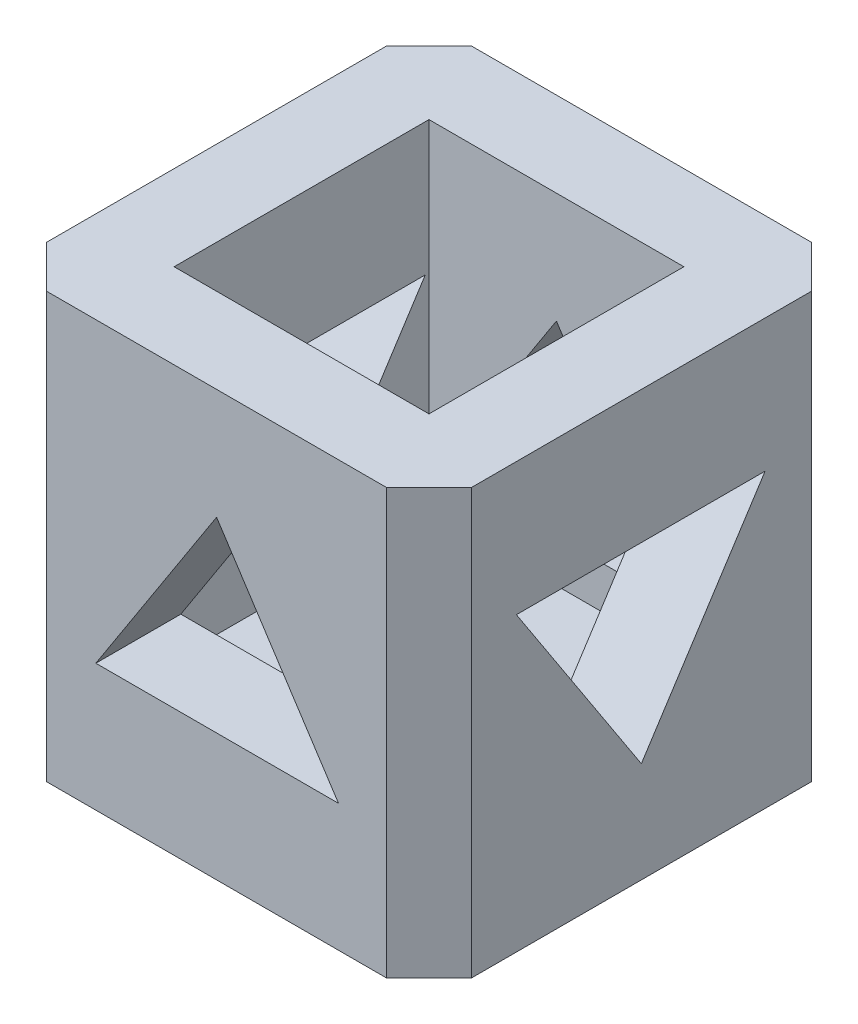
ISO-10303-21;
HEADER;
FILE_DESCRIPTION(('STEP AP214'),'2;1');
FILE_NAME('part.step','',(''),(''),'','','');
FILE_SCHEMA(('AUTOMOTIVE_DESIGN { 1 0 10303 214 1 1 1 1 }'));
ENDSEC;
DATA;
#1=APPLICATION_CONTEXT('core data for automotive mechanical design processes');
#2=APPLICATION_PROTOCOL_DEFINITION('international standard','automotive_design',2000,#1);
#3=PRODUCT_CONTEXT('',#1,'mechanical');
#4=PRODUCT('Part','Part','',(#3));
#5=PRODUCT_RELATED_PRODUCT_CATEGORY('part','',(#4));
#6=PRODUCT_DEFINITION_FORMATION('','',#4);
#7=PRODUCT_DEFINITION_CONTEXT('part definition',#1,'design');
#8=PRODUCT_DEFINITION('design','',#6,#7);
#9=PRODUCT_DEFINITION_SHAPE('','',#8);
#10=(LENGTH_UNIT() NAMED_UNIT(*) SI_UNIT(.MILLI.,.METRE.));
#11=(NAMED_UNIT(*) PLANE_ANGLE_UNIT() SI_UNIT($,.RADIAN.));
#12=(NAMED_UNIT(*) SI_UNIT($,.STERADIAN.) SOLID_ANGLE_UNIT());
#13=UNCERTAINTY_MEASURE_WITH_UNIT(LENGTH_MEASURE(1.E-05),#10,'distance_accuracy_value','');
#14=(GEOMETRIC_REPRESENTATION_CONTEXT(3) GLOBAL_UNCERTAINTY_ASSIGNED_CONTEXT((#13)) GLOBAL_UNIT_ASSIGNED_CONTEXT((#10,
#11,#12)) REPRESENTATION_CONTEXT('',''));
#15=CARTESIAN_POINT('',(0.,0.,0.));
#16=DIRECTION('',(0.,0.,1.));
#17=DIRECTION('',(1.,0.,0.));
#18=AXIS2_PLACEMENT_3D('',#15,#16,#17);
#19=CARTESIAN_POINT('',(-10.,4.,-10.));
#20=DIRECTION('',(0.,0.,1.));
#21=DIRECTION('',(1.,0.,0.));
#22=AXIS2_PLACEMENT_3D('',#19,#20,#21);
#23=PLANE('',#22);
#24=DIRECTION('',(1.,0.,0.));
#25=VECTOR('',#24,1.);
#26=CARTESIAN_POINT('',(-10.,5.99136703861879,-10.));
#27=LINE('',#26,#25);
#28=CARTESIAN_POINT('',(-5.68500652357617,5.99136703861879,-10.));
#29=VERTEX_POINT('',#28);
#30=CARTESIAN_POINT('',(5.73967274341431,5.99136703861879,-10.));
#31=VERTEX_POINT('',#30);
#32=EDGE_CURVE('E272',#29,#31,#27,.T.);
#33=ORIENTED_EDGE('',*,*,#32,.T.);
#34=DIRECTION('',(-0.546505514379067,0.83745550493938,0.));
#35=VECTOR('',#34,1.);
#36=CARTESIAN_POINT('',(1.95012882129267,11.7983979564973,-10.));
#37=LINE('',#36,#35);
#38=CARTESIAN_POINT('',(0.,14.7867413011899,-10.));
#39=VERTEX_POINT('',#38);
#40=EDGE_CURVE('E277',#31,#39,#37,.T.);
#41=ORIENTED_EDGE('',*,*,#40,.T.);
#42=DIRECTION('',(-0.542839434163887,-0.839836501181409,0.));
#43=VECTOR('',#42,1.);
#44=CARTESIAN_POINT('',(-7.8643827279489,2.61961552049709,-10.));
#45=LINE('',#44,#43);
#46=EDGE_CURVE('E266',#39,#29,#45,.T.);
#47=ORIENTED_EDGE('',*,*,#46,.T.);
#48=EDGE_LOOP('',(#33,#41,#47));
#49=FACE_BOUND('',#48,.T.);
#50=DIRECTION('',(-1.,0.,0.));
#51=VECTOR('',#50,1.);
#52=CARTESIAN_POINT('',(-10.,20.,-10.));
#53=LINE('',#52,#51);
#54=CARTESIAN_POINT('',(8.,20.,-10.));
#55=VERTEX_POINT('',#54);
#56=CARTESIAN_POINT('',(-7.99999999999999,20.,-10.));
#57=VERTEX_POINT('',#56);
#58=EDGE_CURVE('E316',#55,#57,#53,.T.);
#59=ORIENTED_EDGE('',*,*,#58,.F.);
#60=DIRECTION('',(0.,-1.,0.));
#61=VECTOR('',#60,1.);
#62=CARTESIAN_POINT('',(8.,4.,-10.));
#63=LINE('',#62,#61);
#64=CARTESIAN_POINT('',(8.,0.,-10.));
#65=VERTEX_POINT('',#64);
#66=EDGE_CURVE('E344',#55,#65,#63,.T.);
#67=ORIENTED_EDGE('',*,*,#66,.T.);
#68=DIRECTION('',(-1.,0.,0.));
#69=VECTOR('',#68,1.);
#70=CARTESIAN_POINT('',(-10.,0.,-10.));
#71=LINE('',#70,#69);
#72=CARTESIAN_POINT('',(-7.99999999999999,0.,-10.));
#73=VERTEX_POINT('',#72);
#74=EDGE_CURVE('E319',#65,#73,#71,.T.);
#75=ORIENTED_EDGE('',*,*,#74,.T.);
#76=DIRECTION('',(0.,1.,0.));
#77=VECTOR('',#76,1.);
#78=CARTESIAN_POINT('',(-7.99999999999999,4.,-10.));
#79=LINE('',#78,#77);
#80=EDGE_CURVE('E342',#73,#57,#79,.T.);
#81=ORIENTED_EDGE('',*,*,#80,.T.);
#82=EDGE_LOOP('',(#59,#67,#75,#81));
#83=FACE_BOUND('',#82,.T.);
#84=ADVANCED_FACE('F35',(#49,#83),#23,.F.);
#85=CARTESIAN_POINT('',(-10.,4.,10.));
#86=DIRECTION('',(1.,0.,0.));
#87=DIRECTION('',(0.,0.,-1.));
#88=AXIS2_PLACEMENT_3D('',#85,#86,#87);
#89=PLANE('',#88);
#90=DIRECTION('',(0.,0.,1.));
#91=VECTOR('',#90,1.);
#92=CARTESIAN_POINT('',(-10.,13.7547902893006,10.));
#93=LINE('',#92,#91);
#94=CARTESIAN_POINT('',(-10.,13.7547902893006,-5.82500419723984));
#95=VERTEX_POINT('',#94);
#96=CARTESIAN_POINT('',(-10.,13.7547902893006,5.88566383682266));
#97=VERTEX_POINT('',#96);
#98=EDGE_CURVE('E237',#95,#97,#93,.T.);
#99=ORIENTED_EDGE('',*,*,#98,.T.);
#100=DIRECTION('',(0.,-0.837455504939375,-0.546505514379073));
#101=VECTOR('',#100,1.);
#102=CARTESIAN_POINT('',(-10.,8.79647131162845,2.64997113749006));
#103=LINE('',#102,#101);
#104=CARTESIAN_POINT('',(-10.,4.73924544841337,0.00231249264187865));
#105=VERTEX_POINT('',#104);
#106=EDGE_CURVE('E243',#97,#105,#103,.T.);
#107=ORIENTED_EDGE('',*,*,#106,.T.);
#108=DIRECTION('',(0.,0.839836501181413,-0.542839434163881));
#109=VECTOR('',#108,1.);
#110=CARTESIAN_POINT('',(-10.,-0.340072559187292,3.28539688979022));
#111=LINE('',#110,#109);
#112=EDGE_CURVE('E232',#105,#95,#111,.T.);
#113=ORIENTED_EDGE('',*,*,#112,.T.);
#114=EDGE_LOOP('',(#99,#107,#113));
#115=FACE_BOUND('',#114,.T.);
#116=DIRECTION('',(0.,0.,1.));
#117=VECTOR('',#116,1.);
#118=CARTESIAN_POINT('',(-10.,0.,10.));
#119=LINE('',#118,#117);
#120=CARTESIAN_POINT('',(-10.,0.,-8.));
#121=VERTEX_POINT('',#120);
#122=CARTESIAN_POINT('',(-10.,0.,7.99999999999999));
#123=VERTEX_POINT('',#122);
#124=EDGE_CURVE('E322',#121,#123,#119,.T.);
#125=ORIENTED_EDGE('',*,*,#124,.T.);
#126=DIRECTION('',(0.,1.,0.));
#127=VECTOR('',#126,1.);
#128=CARTESIAN_POINT('',(-10.,4.,7.99999999999999));
#129=LINE('',#128,#127);
#130=CARTESIAN_POINT('',(-10.,20.,7.99999999999999));
#131=VERTEX_POINT('',#130);
#132=EDGE_CURVE('E11',#123,#131,#129,.T.);
#133=ORIENTED_EDGE('',*,*,#132,.T.);
#134=DIRECTION('',(0.,0.,1.));
#135=VECTOR('',#134,1.);
#136=CARTESIAN_POINT('',(-10.,20.,-10.));
#137=LINE('',#136,#135);
#138=CARTESIAN_POINT('',(-10.,20.,-8.));
#139=VERTEX_POINT('',#138);
#140=EDGE_CURVE('E309',#139,#131,#137,.T.);
#141=ORIENTED_EDGE('',*,*,#140,.F.);
#142=DIRECTION('',(0.,-1.,0.));
#143=VECTOR('',#142,1.);
#144=CARTESIAN_POINT('',(-10.,4.,-8.));
#145=LINE('',#144,#143);
#146=EDGE_CURVE('E44',#139,#121,#145,.T.);
#147=ORIENTED_EDGE('',*,*,#146,.T.);
#148=EDGE_LOOP('',(#125,#133,#141,#147));
#149=FACE_BOUND('',#148,.T.);
#150=ADVANCED_FACE('F375',(#115,#149),#89,.F.);
#151=CARTESIAN_POINT('',(-10.,4.,10.));
#152=DIRECTION('',(0.,0.,-1.));
#153=DIRECTION('',(-1.,0.,0.));
#154=AXIS2_PLACEMENT_3D('',#151,#152,#153);
#155=PLANE('',#154);
#156=DIRECTION('',(-0.542839434163887,-0.839836501181409,0.));
#157=VECTOR('',#156,1.);
#158=CARTESIAN_POINT('',(0.,14.7867413011899,10.));
#159=LINE('',#158,#157);
#160=CARTESIAN_POINT('',(0.,14.7867413011899,10.));
#161=VERTEX_POINT('',#160);
#162=CARTESIAN_POINT('',(-5.68500652357618,5.99136703861879,10.));
#163=VERTEX_POINT('',#162);
#164=EDGE_CURVE('E248',#161,#163,#159,.T.);
#165=ORIENTED_EDGE('',*,*,#164,.F.);
#166=DIRECTION('',(-0.546505514379067,0.837455504939379,0.));
#167=VECTOR('',#166,1.);
#168=CARTESIAN_POINT('',(5.73967274341431,5.99136703861879,10.));
#169=LINE('',#168,#167);
#170=CARTESIAN_POINT('',(5.73967274341431,5.99136703861879,10.));
#171=VERTEX_POINT('',#170);
#172=EDGE_CURVE('E246',#171,#161,#169,.T.);
#173=ORIENTED_EDGE('',*,*,#172,.F.);
#174=DIRECTION('',(1.,0.,0.));
#175=VECTOR('',#174,1.);
#176=CARTESIAN_POINT('',(-5.68500652357618,5.99136703861879,10.));
#177=LINE('',#176,#175);
#178=EDGE_CURVE('E251',#163,#171,#177,.T.);
#179=ORIENTED_EDGE('',*,*,#178,.F.);
#180=EDGE_LOOP('',(#165,#173,#179));
#181=FACE_BOUND('',#180,.T.);
#182=DIRECTION('',(1.,0.,0.));
#183=VECTOR('',#182,1.);
#184=CARTESIAN_POINT('',(-10.,0.,10.));
#185=LINE('',#184,#183);
#186=CARTESIAN_POINT('',(-8.,0.,10.));
#187=VERTEX_POINT('',#186);
#188=CARTESIAN_POINT('',(7.99999999999999,0.,10.));
#189=VERTEX_POINT('',#188);
#190=EDGE_CURVE('E325',#187,#189,#185,.T.);
#191=ORIENTED_EDGE('',*,*,#190,.T.);
#192=DIRECTION('',(0.,1.,0.));
#193=VECTOR('',#192,1.);
#194=CARTESIAN_POINT('',(7.99999999999999,4.,10.));
#195=LINE('',#194,#193);
#196=CARTESIAN_POINT('',(7.99999999999999,20.,10.));
#197=VERTEX_POINT('',#196);
#198=EDGE_CURVE('E51',#189,#197,#195,.T.);
#199=ORIENTED_EDGE('',*,*,#198,.T.);
#200=DIRECTION('',(1.,0.,0.));
#201=VECTOR('',#200,1.);
#202=CARTESIAN_POINT('',(-10.,20.,10.));
#203=LINE('',#202,#201);
#204=CARTESIAN_POINT('',(-8.,20.,10.));
#205=VERTEX_POINT('',#204);
#206=EDGE_CURVE('E311',#205,#197,#203,.T.);
#207=ORIENTED_EDGE('',*,*,#206,.F.);
#208=DIRECTION('',(0.,-1.,0.));
#209=VECTOR('',#208,1.);
#210=CARTESIAN_POINT('',(-8.,4.,10.));
#211=LINE('',#210,#209);
#212=EDGE_CURVE('E367',#205,#187,#211,.T.);
#213=ORIENTED_EDGE('',*,*,#212,.T.);
#214=EDGE_LOOP('',(#191,#199,#207,#213));
#215=FACE_BOUND('',#214,.T.);
#216=ADVANCED_FACE('F386',(#181,#215),#155,.F.);
#217=CARTESIAN_POINT('',(10.,4.,10.));
#218=DIRECTION('',(-1.,0.,0.));
#219=DIRECTION('',(0.,0.,1.));
#220=AXIS2_PLACEMENT_3D('',#217,#218,#219);
#221=PLANE('',#220);
#222=DIRECTION('',(0.,0.839836501181413,-0.542839434163881));
#223=VECTOR('',#222,1.);
#224=CARTESIAN_POINT('',(10.,4.73924544841337,0.00231249264187865));
#225=LINE('',#224,#223);
#226=CARTESIAN_POINT('',(10.,4.73924544841337,0.00231249264187735));
#227=VERTEX_POINT('',#226);
#228=CARTESIAN_POINT('',(10.,13.7547902893006,-5.82500419723984));
#229=VERTEX_POINT('',#228);
#230=EDGE_CURVE('E214',#227,#229,#225,.T.);
#231=ORIENTED_EDGE('',*,*,#230,.F.);
#232=DIRECTION('',(0.,-0.837455504939375,-0.546505514379073));
#233=VECTOR('',#232,1.);
#234=CARTESIAN_POINT('',(10.,13.7547902893006,5.88566383682266));
#235=LINE('',#234,#233);
#236=CARTESIAN_POINT('',(10.,13.7547902893006,5.88566383682266));
#237=VERTEX_POINT('',#236);
#238=EDGE_CURVE('E219',#237,#227,#235,.T.);
#239=ORIENTED_EDGE('',*,*,#238,.F.);
#240=DIRECTION('',(0.,0.,1.));
#241=VECTOR('',#240,1.);
#242=CARTESIAN_POINT('',(10.,13.7547902893006,-5.82500419723984));
#243=LINE('',#242,#241);
#244=EDGE_CURVE('E203',#229,#237,#243,.T.);
#245=ORIENTED_EDGE('',*,*,#244,.F.);
#246=EDGE_LOOP('',(#231,#239,#245));
#247=FACE_BOUND('',#246,.T.);
#248=DIRECTION('',(0.,0.,-1.));
#249=VECTOR('',#248,1.);
#250=CARTESIAN_POINT('',(10.,0.,10.));
#251=LINE('',#250,#249);
#252=CARTESIAN_POINT('',(10.,0.,8.));
#253=VERTEX_POINT('',#252);
#254=CARTESIAN_POINT('',(10.,0.,-7.99999999999999));
#255=VERTEX_POINT('',#254);
#256=EDGE_CURVE('E327',#253,#255,#251,.T.);
#257=ORIENTED_EDGE('',*,*,#256,.T.);
#258=DIRECTION('',(0.,1.,0.));
#259=VECTOR('',#258,1.);
#260=CARTESIAN_POINT('',(10.,4.,-7.99999999999999));
#261=LINE('',#260,#259);
#262=CARTESIAN_POINT('',(10.,20.,-7.99999999999999));
#263=VERTEX_POINT('',#262);
#264=EDGE_CURVE('E358',#255,#263,#261,.T.);
#265=ORIENTED_EDGE('',*,*,#264,.T.);
#266=DIRECTION('',(0.,0.,-1.));
#267=VECTOR('',#266,1.);
#268=CARTESIAN_POINT('',(10.,20.,-10.));
#269=LINE('',#268,#267);
#270=CARTESIAN_POINT('',(10.,20.,8.));
#271=VERTEX_POINT('',#270);
#272=EDGE_CURVE('E313',#271,#263,#269,.T.);
#273=ORIENTED_EDGE('',*,*,#272,.F.);
#274=DIRECTION('',(0.,-1.,0.));
#275=VECTOR('',#274,1.);
#276=CARTESIAN_POINT('',(10.,4.,8.));
#277=LINE('',#276,#275);
#278=EDGE_CURVE('E355',#271,#253,#277,.T.);
#279=ORIENTED_EDGE('',*,*,#278,.T.);
#280=EDGE_LOOP('',(#257,#265,#273,#279));
#281=FACE_BOUND('',#280,.T.);
#282=ADVANCED_FACE('F221',(#247,#281),#221,.F.);
#283=CARTESIAN_POINT('',(0.,0.,0.));
#284=DIRECTION('',(0.,1.,0.));
#285=DIRECTION('',(0.,0.,1.));
#286=AXIS2_PLACEMENT_3D('',#283,#284,#285);
#287=PLANE('',#286);
#288=ORIENTED_EDGE('',*,*,#74,.F.);
#289=DIRECTION('',(-0.707106781186547,0.,-0.707106781186548));
#290=VECTOR('',#289,1.);
#291=CARTESIAN_POINT('',(8.,0.,-10.));
#292=LINE('',#291,#290);
#293=EDGE_CURVE('E353',#65,#255,#292,.F.);
#294=ORIENTED_EDGE('',*,*,#293,.T.);
#295=ORIENTED_EDGE('',*,*,#256,.F.);
#296=DIRECTION('',(0.707106781186548,0.,-0.707106781186547));
#297=VECTOR('',#296,1.);
#298=CARTESIAN_POINT('',(10.,0.,8.));
#299=LINE('',#298,#297);
#300=EDGE_CURVE('E351',#253,#189,#299,.F.);
#301=ORIENTED_EDGE('',*,*,#300,.T.);
#302=ORIENTED_EDGE('',*,*,#190,.F.);
#303=DIRECTION('',(0.707106781186547,0.,0.707106781186548));
#304=VECTOR('',#303,1.);
#305=CARTESIAN_POINT('',(-8.,0.,10.));
#306=LINE('',#305,#304);
#307=EDGE_CURVE('E349',#187,#123,#306,.F.);
#308=ORIENTED_EDGE('',*,*,#307,.T.);
#309=ORIENTED_EDGE('',*,*,#124,.F.);
#310=DIRECTION('',(-0.707106781186548,0.,0.707106781186547));
#311=VECTOR('',#310,1.);
#312=CARTESIAN_POINT('',(-10.,0.,-8.));
#313=LINE('',#312,#311);
#314=EDGE_CURVE('E347',#121,#73,#313,.F.);
#315=ORIENTED_EDGE('',*,*,#314,.T.);
#316=EDGE_LOOP('',(#288,#294,#295,#301,#302,#308,#309,#315));
#317=FACE_BOUND('',#316,.T.);
#318=ADVANCED_FACE('F381',(#317),#287,.F.);
#319=CARTESIAN_POINT('',(0.,20.,0.));
#320=DIRECTION('',(0.,1.,0.));
#321=DIRECTION('',(0.,0.,1.));
#322=AXIS2_PLACEMENT_3D('',#319,#320,#321);
#323=PLANE('',#322);
#324=ORIENTED_EDGE('',*,*,#272,.T.);
#325=DIRECTION('',(0.707106781186547,0.,0.707106781186548));
#326=VECTOR('',#325,1.);
#327=CARTESIAN_POINT('',(9.00000000000001,20.,-8.99999999999999));
#328=LINE('',#327,#326);
#329=EDGE_CURVE('E365',#263,#55,#328,.F.);
#330=ORIENTED_EDGE('',*,*,#329,.T.);
#331=ORIENTED_EDGE('',*,*,#58,.T.);
#332=DIRECTION('',(0.707106781186548,0.,-0.707106781186547));
#333=VECTOR('',#332,1.);
#334=CARTESIAN_POINT('',(-8.99999999999999,20.,-9.00000000000001));
#335=LINE('',#334,#333);
#336=EDGE_CURVE('E360',#57,#139,#335,.F.);
#337=ORIENTED_EDGE('',*,*,#336,.T.);
#338=ORIENTED_EDGE('',*,*,#140,.T.);
#339=DIRECTION('',(-0.707106781186547,0.,-0.707106781186548));
#340=VECTOR('',#339,1.);
#341=CARTESIAN_POINT('',(-9.00000000000001,20.,8.99999999999999));
#342=LINE('',#341,#340);
#343=EDGE_CURVE('E58',#131,#205,#342,.F.);
#344=ORIENTED_EDGE('',*,*,#343,.T.);
#345=ORIENTED_EDGE('',*,*,#206,.T.);
#346=DIRECTION('',(-0.707106781186548,0.,0.707106781186547));
#347=VECTOR('',#346,1.);
#348=CARTESIAN_POINT('',(8.99999999999999,20.,9.00000000000001));
#349=LINE('',#348,#347);
#350=EDGE_CURVE('E363',#197,#271,#349,.F.);
#351=ORIENTED_EDGE('',*,*,#350,.T.);
#352=EDGE_LOOP('',(#324,#330,#331,#337,#338,#344,#345,#351));
#353=FACE_BOUND('',#352,.T.);
#354=DIRECTION('',(1.,0.,0.));
#355=VECTOR('',#354,1.);
#356=CARTESIAN_POINT('',(-6.,20.,6.));
#357=LINE('',#356,#355);
#358=CARTESIAN_POINT('',(-6.,20.,6.));
#359=VERTEX_POINT('',#358);
#360=CARTESIAN_POINT('',(6.,20.,6.));
#361=VERTEX_POINT('',#360);
#362=EDGE_CURVE('E283',#359,#361,#357,.T.);
#363=ORIENTED_EDGE('',*,*,#362,.F.);
#364=DIRECTION('',(0.,0.,1.));
#365=VECTOR('',#364,1.);
#366=CARTESIAN_POINT('',(-6.,20.,-6.));
#367=LINE('',#366,#365);
#368=CARTESIAN_POINT('',(-6.,20.,-6.));
#369=VERTEX_POINT('',#368);
#370=EDGE_CURVE('E281',#369,#359,#367,.T.);
#371=ORIENTED_EDGE('',*,*,#370,.F.);
#372=DIRECTION('',(-1.,0.,0.));
#373=VECTOR('',#372,1.);
#374=CARTESIAN_POINT('',(-6.,20.,-6.));
#375=LINE('',#374,#373);
#376=CARTESIAN_POINT('',(6.,20.,-6.));
#377=VERTEX_POINT('',#376);
#378=EDGE_CURVE('E289',#377,#369,#375,.T.);
#379=ORIENTED_EDGE('',*,*,#378,.F.);
#380=DIRECTION('',(0.,0.,-1.));
#381=VECTOR('',#380,1.);
#382=CARTESIAN_POINT('',(6.,20.,-6.));
#383=LINE('',#382,#381);
#384=EDGE_CURVE('E286',#361,#377,#383,.T.);
#385=ORIENTED_EDGE('',*,*,#384,.F.);
#386=EDGE_LOOP('',(#363,#371,#379,#385));
#387=FACE_BOUND('',#386,.T.);
#388=ADVANCED_FACE('F388',(#353,#387),#323,.T.);
#389=CARTESIAN_POINT('',(-6.,20.,-6.));
#390=DIRECTION('',(1.,0.,0.));
#391=DIRECTION('',(0.,0.,-1.));
#392=AXIS2_PLACEMENT_3D('',#389,#390,#391);
#393=PLANE('',#392);
#394=DIRECTION('',(0.,-0.837455504939375,-0.546505514379073));
#395=VECTOR('',#394,1.);
#396=CARTESIAN_POINT('',(-6.,12.694994051737,5.19406352548597));
#397=LINE('',#396,#395);
#398=CARTESIAN_POINT('',(-6.,13.7547902893006,5.88566383682266));
#399=VERTEX_POINT('',#398);
#400=CARTESIAN_POINT('',(-6.,4.73924544841337,0.00231249264187605));
#401=VERTEX_POINT('',#400);
#402=EDGE_CURVE('E240',#399,#401,#397,.T.);
#403=ORIENTED_EDGE('',*,*,#402,.F.);
#404=DIRECTION('',(0.,0.,1.));
#405=VECTOR('',#404,1.);
#406=CARTESIAN_POINT('',(-6.,13.7547902893006,-6.));
#407=LINE('',#406,#405);
#408=CARTESIAN_POINT('',(-6.,13.7547902893006,-5.82500419723984));
#409=VERTEX_POINT('',#408);
#410=EDGE_CURVE('E235',#409,#399,#407,.T.);
#411=ORIENTED_EDGE('',*,*,#410,.F.);
#412=DIRECTION('',(0.,0.839836501181413,-0.542839434163881));
#413=VECTOR('',#412,1.);
#414=CARTESIAN_POINT('',(-6.,18.2394749577428,-8.72373946820746));
#415=LINE('',#414,#413);
#416=EDGE_CURVE('E230',#401,#409,#415,.T.);
#417=ORIENTED_EDGE('',*,*,#416,.F.);
#418=EDGE_LOOP('',(#403,#411,#417));
#419=FACE_BOUND('',#418,.T.);
#420=DIRECTION('',(0.,0.,1.));
#421=VECTOR('',#420,1.);
#422=CARTESIAN_POINT('',(-6.,4.,-6.));
#423=LINE('',#422,#421);
#424=CARTESIAN_POINT('',(-6.,4.,-6.));
#425=VERTEX_POINT('',#424);
#426=CARTESIAN_POINT('',(-6.,4.,6.));
#427=VERTEX_POINT('',#426);
#428=EDGE_CURVE('E280',#425,#427,#423,.T.);
#429=ORIENTED_EDGE('',*,*,#428,.F.);
#430=DIRECTION('',(0.,-1.,0.));
#431=VECTOR('',#430,1.);
#432=CARTESIAN_POINT('',(-6.,20.,-6.));
#433=LINE('',#432,#431);
#434=EDGE_CURVE('E291',#369,#425,#433,.T.);
#435=ORIENTED_EDGE('',*,*,#434,.F.);
#436=ORIENTED_EDGE('',*,*,#370,.T.);
#437=DIRECTION('',(0.,-1.,0.));
#438=VECTOR('',#437,1.);
#439=CARTESIAN_POINT('',(-6.,20.,6.));
#440=LINE('',#439,#438);
#441=EDGE_CURVE('E306',#359,#427,#440,.T.);
#442=ORIENTED_EDGE('',*,*,#441,.T.);
#443=EDGE_LOOP('',(#429,#435,#436,#442));
#444=FACE_BOUND('',#443,.T.);
#445=ADVANCED_FACE('F579',(#419,#444),#393,.T.);
#446=CARTESIAN_POINT('',(-6.,20.,6.));
#447=DIRECTION('',(0.,0.,-1.));
#448=DIRECTION('',(-1.,0.,0.));
#449=AXIS2_PLACEMENT_3D('',#446,#447,#448);
#450=PLANE('',#449);
#451=DIRECTION('',(0.546505514379067,-0.83745550493938,0.));
#452=VECTOR('',#451,1.);
#453=CARTESIAN_POINT('',(-4.17798289366406,21.1890093145637,6.));
#454=LINE('',#453,#452);
#455=CARTESIAN_POINT('',(0.,14.7867413011899,6.));
#456=VERTEX_POINT('',#455);
#457=CARTESIAN_POINT('',(5.73967274341431,5.99136703861879,6.));
#458=VERTEX_POINT('',#457);
#459=EDGE_CURVE('E275',#456,#458,#454,.T.);
#460=ORIENTED_EDGE('',*,*,#459,.F.);
#461=DIRECTION('',(0.542839434163887,0.839836501181409,0.));
#462=VECTOR('',#461,1.);
#463=CARTESIAN_POINT('',(0.60865781464849,15.7284065843292,6.));
#464=LINE('',#463,#462);
#465=CARTESIAN_POINT('',(-5.68500652357617,5.99136703861879,6.));
#466=VERTEX_POINT('',#465);
#467=EDGE_CURVE('E264',#466,#456,#464,.T.);
#468=ORIENTED_EDGE('',*,*,#467,.F.);
#469=DIRECTION('',(-1.,0.,0.));
#470=VECTOR('',#469,1.);
#471=CARTESIAN_POINT('',(-6.,5.99136703861879,6.));
#472=LINE('',#471,#470);
#473=EDGE_CURVE('E269',#458,#466,#472,.T.);
#474=ORIENTED_EDGE('',*,*,#473,.F.);
#475=EDGE_LOOP('',(#460,#468,#474));
#476=FACE_BOUND('',#475,.T.);
#477=DIRECTION('',(1.,0.,0.));
#478=VECTOR('',#477,1.);
#479=CARTESIAN_POINT('',(-6.,4.,6.));
#480=LINE('',#479,#478);
#481=CARTESIAN_POINT('',(6.,4.,6.));
#482=VERTEX_POINT('',#481);
#483=EDGE_CURVE('E293',#427,#482,#480,.T.);
#484=ORIENTED_EDGE('',*,*,#483,.F.);
#485=ORIENTED_EDGE('',*,*,#441,.F.);
#486=ORIENTED_EDGE('',*,*,#362,.T.);
#487=DIRECTION('',(0.,-1.,0.));
#488=VECTOR('',#487,1.);
#489=CARTESIAN_POINT('',(6.,20.,6.));
#490=LINE('',#489,#488);
#491=EDGE_CURVE('E303',#361,#482,#490,.T.);
#492=ORIENTED_EDGE('',*,*,#491,.T.);
#493=EDGE_LOOP('',(#484,#485,#486,#492));
#494=FACE_BOUND('',#493,.T.);
#495=ADVANCED_FACE('F571',(#476,#494),#450,.T.);
#496=CARTESIAN_POINT('',(6.,20.,-6.));
#497=DIRECTION('',(-1.,0.,0.));
#498=DIRECTION('',(0.,0.,1.));
#499=AXIS2_PLACEMENT_3D('',#496,#497,#498);
#500=PLANE('',#499);
#501=DIRECTION('',(0.,0.837455504939375,0.546505514379073));
#502=VECTOR('',#501,1.);
#503=CARTESIAN_POINT('',(6.,12.694994051737,5.19406352548597));
#504=LINE('',#503,#502);
#505=CARTESIAN_POINT('',(6.,4.73924544841337,0.00231249264187865));
#506=VERTEX_POINT('',#505);
#507=CARTESIAN_POINT('',(6.,13.7547902893006,5.88566383682266));
#508=VERTEX_POINT('',#507);
#509=EDGE_CURVE('E340',#506,#508,#504,.T.);
#510=ORIENTED_EDGE('',*,*,#509,.F.);
#511=DIRECTION('',(0.,-0.839836501181413,0.542839434163881));
#512=VECTOR('',#511,1.);
#513=CARTESIAN_POINT('',(6.,18.2394749577428,-8.72373946820746));
#514=LINE('',#513,#512);
#515=CARTESIAN_POINT('',(6.,13.7547902893006,-5.82500419723984));
#516=VERTEX_POINT('',#515);
#517=EDGE_CURVE('E337',#516,#506,#514,.T.);
#518=ORIENTED_EDGE('',*,*,#517,.F.);
#519=DIRECTION('',(0.,0.,-1.));
#520=VECTOR('',#519,1.);
#521=CARTESIAN_POINT('',(6.,13.7547902893006,-6.));
#522=LINE('',#521,#520);
#523=EDGE_CURVE('E206',#508,#516,#522,.T.);
#524=ORIENTED_EDGE('',*,*,#523,.F.);
#525=EDGE_LOOP('',(#510,#518,#524));
#526=FACE_BOUND('',#525,.T.);
#527=DIRECTION('',(0.,0.,-1.));
#528=VECTOR('',#527,1.);
#529=CARTESIAN_POINT('',(6.,4.,-6.));
#530=LINE('',#529,#528);
#531=CARTESIAN_POINT('',(6.,4.,-6.));
#532=VERTEX_POINT('',#531);
#533=EDGE_CURVE('E295',#482,#532,#530,.T.);
#534=ORIENTED_EDGE('',*,*,#533,.F.);
#535=ORIENTED_EDGE('',*,*,#491,.F.);
#536=ORIENTED_EDGE('',*,*,#384,.T.);
#537=DIRECTION('',(0.,-1.,0.));
#538=VECTOR('',#537,1.);
#539=CARTESIAN_POINT('',(6.,20.,-6.));
#540=LINE('',#539,#538);
#541=EDGE_CURVE('E300',#377,#532,#540,.T.);
#542=ORIENTED_EDGE('',*,*,#541,.T.);
#543=EDGE_LOOP('',(#534,#535,#536,#542));
#544=FACE_BOUND('',#543,.T.);
#545=ADVANCED_FACE('F562',(#526,#544),#500,.T.);
#546=CARTESIAN_POINT('',(-6.,20.,-6.));
#547=DIRECTION('',(0.,0.,1.));
#548=DIRECTION('',(1.,0.,0.));
#549=AXIS2_PLACEMENT_3D('',#546,#547,#548);
#550=PLANE('',#549);
#551=DIRECTION('',(-0.546505514379067,0.83745550493938,0.));
#552=VECTOR('',#551,1.);
#553=CARTESIAN_POINT('',(-4.17798289366406,21.1890093145637,-6.));
#554=LINE('',#553,#552);
#555=CARTESIAN_POINT('',(5.73967274341431,5.99136703861879,-6.));
#556=VERTEX_POINT('',#555);
#557=CARTESIAN_POINT('',(0.,14.7867413011899,-6.));
#558=VERTEX_POINT('',#557);
#559=EDGE_CURVE('E334',#556,#558,#554,.T.);
#560=ORIENTED_EDGE('',*,*,#559,.F.);
#561=DIRECTION('',(1.,0.,0.));
#562=VECTOR('',#561,1.);
#563=CARTESIAN_POINT('',(-6.,5.99136703861879,-6.));
#564=LINE('',#563,#562);
#565=CARTESIAN_POINT('',(-5.68500652357618,5.99136703861879,-6.));
#566=VERTEX_POINT('',#565);
#567=EDGE_CURVE('E332',#566,#556,#564,.T.);
#568=ORIENTED_EDGE('',*,*,#567,.F.);
#569=DIRECTION('',(-0.542839434163887,-0.839836501181409,0.));
#570=VECTOR('',#569,1.);
#571=CARTESIAN_POINT('',(0.608657814648489,15.7284065843292,-6.));
#572=LINE('',#571,#570);
#573=EDGE_CURVE('E330',#558,#566,#572,.T.);
#574=ORIENTED_EDGE('',*,*,#573,.F.);
#575=EDGE_LOOP('',(#560,#568,#574));
#576=FACE_BOUND('',#575,.T.);
#577=DIRECTION('',(-1.,0.,0.));
#578=VECTOR('',#577,1.);
#579=CARTESIAN_POINT('',(-6.,4.,-6.));
#580=LINE('',#579,#578);
#581=EDGE_CURVE('E284',#532,#425,#580,.T.);
#582=ORIENTED_EDGE('',*,*,#581,.F.);
#583=ORIENTED_EDGE('',*,*,#541,.F.);
#584=ORIENTED_EDGE('',*,*,#378,.T.);
#585=ORIENTED_EDGE('',*,*,#434,.T.);
#586=EDGE_LOOP('',(#582,#583,#584,#585));
#587=FACE_BOUND('',#586,.T.);
#588=ADVANCED_FACE('F557',(#576,#587),#550,.T.);
#589=CARTESIAN_POINT('',(0.,4.,0.));
#590=DIRECTION('',(0.,1.,0.));
#591=DIRECTION('',(0.,0.,1.));
#592=AXIS2_PLACEMENT_3D('',#589,#590,#591);
#593=PLANE('',#592);
#594=ORIENTED_EDGE('',*,*,#428,.T.);
#595=ORIENTED_EDGE('',*,*,#483,.T.);
#596=ORIENTED_EDGE('',*,*,#533,.T.);
#597=ORIENTED_EDGE('',*,*,#581,.T.);
#598=EDGE_LOOP('',(#594,#595,#596,#597));
#599=FACE_BOUND('',#598,.T.);
#600=ADVANCED_FACE('F553',(#599),#593,.T.);
#601=CARTESIAN_POINT('',(0.,14.7867413011899,-15.));
#602=DIRECTION('',(-0.839836501181409,0.542839434163887,0.));
#603=DIRECTION('',(-0.542839434163887,-0.839836501181409,0.));
#604=AXIS2_PLACEMENT_3D('',#601,#602,#603);
#605=PLANE('',#604);
#606=DIRECTION('',(0.,0.,1.));
#607=VECTOR('',#606,1.);
#608=CARTESIAN_POINT('',(0.,14.7867413011899,-15.));
#609=LINE('',#608,#607);
#610=EDGE_CURVE('E261',#39,#558,#609,.T.);
#611=ORIENTED_EDGE('',*,*,#610,.T.);
#612=ORIENTED_EDGE('',*,*,#573,.T.);
#613=DIRECTION('',(0.,0.,1.));
#614=VECTOR('',#613,1.);
#615=CARTESIAN_POINT('',(-5.68500652357618,5.99136703861879,-15.));
#616=LINE('',#615,#614);
#617=EDGE_CURVE('E258',#29,#566,#616,.T.);
#618=ORIENTED_EDGE('',*,*,#617,.F.);
#619=ORIENTED_EDGE('',*,*,#46,.F.);
#620=EDGE_LOOP('',(#611,#612,#618,#619));
#621=FACE_BOUND('',#620,.T.);
#622=ADVANCED_FACE('F512',(#621),#605,.F.);
#623=CARTESIAN_POINT('',(-5.68500652357618,5.99136703861879,-15.));
#624=DIRECTION('',(0.,-1.,0.));
#625=DIRECTION('',(1.,0.,0.));
#626=AXIS2_PLACEMENT_3D('',#623,#624,#625);
#627=PLANE('',#626);
#628=ORIENTED_EDGE('',*,*,#617,.T.);
#629=ORIENTED_EDGE('',*,*,#567,.T.);
#630=DIRECTION('',(0.,0.,1.));
#631=VECTOR('',#630,1.);
#632=CARTESIAN_POINT('',(5.73967274341431,5.99136703861879,-15.));
#633=LINE('',#632,#631);
#634=EDGE_CURVE('E257',#31,#556,#633,.T.);
#635=ORIENTED_EDGE('',*,*,#634,.F.);
#636=ORIENTED_EDGE('',*,*,#32,.F.);
#637=EDGE_LOOP('',(#628,#629,#635,#636));
#638=FACE_BOUND('',#637,.T.);
#639=ADVANCED_FACE('F523',(#638),#627,.F.);
#640=CARTESIAN_POINT('',(5.73967274341431,5.99136703861879,-15.));
#641=DIRECTION('',(0.837455504939379,0.546505514379067,0.));
#642=DIRECTION('',(-0.546505514379067,0.83745550493938,0.));
#643=AXIS2_PLACEMENT_3D('',#640,#641,#642);
#644=PLANE('',#643);
#645=ORIENTED_EDGE('',*,*,#634,.T.);
#646=ORIENTED_EDGE('',*,*,#559,.T.);
#647=ORIENTED_EDGE('',*,*,#610,.F.);
#648=ORIENTED_EDGE('',*,*,#40,.F.);
#649=EDGE_LOOP('',(#645,#646,#647,#648));
#650=FACE_BOUND('',#649,.T.);
#651=ADVANCED_FACE('F530',(#650),#644,.F.);
#652=ORIENTED_EDGE('',*,*,#459,.T.);
#653=EDGE_CURVE('E255',#458,#171,#633,.T.);
#654=ORIENTED_EDGE('',*,*,#653,.T.);
#655=ORIENTED_EDGE('',*,*,#172,.T.);
#656=EDGE_CURVE('E254',#456,#161,#609,.T.);
#657=ORIENTED_EDGE('',*,*,#656,.F.);
#658=EDGE_LOOP('',(#652,#654,#655,#657));
#659=FACE_BOUND('',#658,.T.);
#660=ADVANCED_FACE('F520',(#659),#644,.F.);
#661=ORIENTED_EDGE('',*,*,#473,.T.);
#662=EDGE_CURVE('E259',#466,#163,#616,.T.);
#663=ORIENTED_EDGE('',*,*,#662,.T.);
#664=ORIENTED_EDGE('',*,*,#178,.T.);
#665=ORIENTED_EDGE('',*,*,#653,.F.);
#666=EDGE_LOOP('',(#661,#663,#664,#665));
#667=FACE_BOUND('',#666,.T.);
#668=ADVANCED_FACE('F509',(#667),#627,.F.);
#669=ORIENTED_EDGE('',*,*,#467,.T.);
#670=ORIENTED_EDGE('',*,*,#656,.T.);
#671=ORIENTED_EDGE('',*,*,#164,.T.);
#672=ORIENTED_EDGE('',*,*,#662,.F.);
#673=EDGE_LOOP('',(#669,#670,#671,#672));
#674=FACE_BOUND('',#673,.T.);
#675=ADVANCED_FACE('F501',(#674),#605,.F.);
#676=CARTESIAN_POINT('',(-15.,4.73924544841337,0.00231249264187865));
#677=DIRECTION('',(0.,-0.542839434163881,-0.839836501181413));
#678=DIRECTION('',(0.,0.839836501181413,-0.542839434163881));
#679=AXIS2_PLACEMENT_3D('',#676,#677,#678);
#680=PLANE('',#679);
#681=ORIENTED_EDGE('',*,*,#517,.T.);
#682=DIRECTION('',(1.,0.,0.));
#683=VECTOR('',#682,1.);
#684=CARTESIAN_POINT('',(-15.,4.73924544841337,0.00231249264187865));
#685=LINE('',#684,#683);
#686=EDGE_CURVE('E217',#506,#227,#685,.T.);
#687=ORIENTED_EDGE('',*,*,#686,.T.);
#688=ORIENTED_EDGE('',*,*,#230,.T.);
#689=DIRECTION('',(1.,0.,0.));
#690=VECTOR('',#689,1.);
#691=CARTESIAN_POINT('',(-15.,13.7547902893006,-5.82500419723984));
#692=LINE('',#691,#690);
#693=EDGE_CURVE('E198',#516,#229,#692,.T.);
#694=ORIENTED_EDGE('',*,*,#693,.F.);
#695=EDGE_LOOP('',(#681,#687,#688,#694));
#696=FACE_BOUND('',#695,.T.);
#697=ADVANCED_FACE('F215',(#696),#680,.F.);
#698=CARTESIAN_POINT('',(-15.,13.7547902893006,-5.82500419723984));
#699=DIRECTION('',(0.,1.,0.));
#700=DIRECTION('',(0.,0.,1.));
#701=AXIS2_PLACEMENT_3D('',#698,#699,#700);
#702=PLANE('',#701);
#703=ORIENTED_EDGE('',*,*,#523,.T.);
#704=ORIENTED_EDGE('',*,*,#693,.T.);
#705=ORIENTED_EDGE('',*,*,#244,.T.);
#706=DIRECTION('',(1.,0.,0.));
#707=VECTOR('',#706,1.);
#708=CARTESIAN_POINT('',(-15.,13.7547902893006,5.88566383682266));
#709=LINE('',#708,#707);
#710=EDGE_CURVE('E227',#508,#237,#709,.T.);
#711=ORIENTED_EDGE('',*,*,#710,.F.);
#712=EDGE_LOOP('',(#703,#704,#705,#711));
#713=FACE_BOUND('',#712,.T.);
#714=ADVANCED_FACE('F200',(#713),#702,.F.);
#715=CARTESIAN_POINT('',(-15.,13.7547902893006,5.88566383682266));
#716=DIRECTION('',(0.,-0.546505514379073,0.837455504939375));
#717=DIRECTION('',(0.,-0.837455504939375,-0.546505514379073));
#718=AXIS2_PLACEMENT_3D('',#715,#716,#717);
#719=PLANE('',#718);
#720=ORIENTED_EDGE('',*,*,#509,.T.);
#721=ORIENTED_EDGE('',*,*,#710,.T.);
#722=ORIENTED_EDGE('',*,*,#238,.T.);
#723=ORIENTED_EDGE('',*,*,#686,.F.);
#724=EDGE_LOOP('',(#720,#721,#722,#723));
#725=FACE_BOUND('',#724,.T.);
#726=ADVANCED_FACE('F479',(#725),#719,.F.);
#727=EDGE_CURVE('E228',#97,#399,#709,.T.);
#728=ORIENTED_EDGE('',*,*,#727,.T.);
#729=ORIENTED_EDGE('',*,*,#402,.T.);
#730=EDGE_CURVE('E210',#105,#401,#685,.T.);
#731=ORIENTED_EDGE('',*,*,#730,.F.);
#732=ORIENTED_EDGE('',*,*,#106,.F.);
#733=EDGE_LOOP('',(#728,#729,#731,#732));
#734=FACE_BOUND('',#733,.T.);
#735=ADVANCED_FACE('F470',(#734),#719,.F.);
#736=EDGE_CURVE('E209',#95,#409,#692,.T.);
#737=ORIENTED_EDGE('',*,*,#736,.T.);
#738=ORIENTED_EDGE('',*,*,#410,.T.);
#739=ORIENTED_EDGE('',*,*,#727,.F.);
#740=ORIENTED_EDGE('',*,*,#98,.F.);
#741=EDGE_LOOP('',(#737,#738,#739,#740));
#742=FACE_BOUND('',#741,.T.);
#743=ADVANCED_FACE('F461',(#742),#702,.F.);
#744=ORIENTED_EDGE('',*,*,#730,.T.);
#745=ORIENTED_EDGE('',*,*,#416,.T.);
#746=ORIENTED_EDGE('',*,*,#736,.F.);
#747=ORIENTED_EDGE('',*,*,#112,.F.);
#748=EDGE_LOOP('',(#744,#745,#746,#747));
#749=FACE_BOUND('',#748,.T.);
#750=ADVANCED_FACE('F424',(#749),#680,.F.);
#751=CARTESIAN_POINT('',(8.,4.,-10.));
#752=DIRECTION('',(-0.707106781186548,0.,0.707106781186547));
#753=DIRECTION('',(0.,-1.,0.));
#754=AXIS2_PLACEMENT_3D('',#751,#752,#753);
#755=PLANE('',#754);
#756=ORIENTED_EDGE('',*,*,#329,.F.);
#757=ORIENTED_EDGE('',*,*,#264,.F.);
#758=ORIENTED_EDGE('',*,*,#293,.F.);
#759=ORIENTED_EDGE('',*,*,#66,.F.);
#760=EDGE_LOOP('',(#756,#757,#758,#759));
#761=FACE_BOUND('',#760,.T.);
#762=ADVANCED_FACE('F399',(#761),#755,.F.);
#763=CARTESIAN_POINT('',(10.,4.,8.));
#764=DIRECTION('',(-0.707106781186547,0.,-0.707106781186548));
#765=DIRECTION('',(0.,-1.,0.));
#766=AXIS2_PLACEMENT_3D('',#763,#764,#765);
#767=PLANE('',#766);
#768=ORIENTED_EDGE('',*,*,#350,.F.);
#769=ORIENTED_EDGE('',*,*,#198,.F.);
#770=ORIENTED_EDGE('',*,*,#300,.F.);
#771=ORIENTED_EDGE('',*,*,#278,.F.);
#772=EDGE_LOOP('',(#768,#769,#770,#771));
#773=FACE_BOUND('',#772,.T.);
#774=ADVANCED_FACE('F393',(#773),#767,.F.);
#775=CARTESIAN_POINT('',(-8.,4.,10.));
#776=DIRECTION('',(0.707106781186548,0.,-0.707106781186547));
#777=DIRECTION('',(0.,-1.,0.));
#778=AXIS2_PLACEMENT_3D('',#775,#776,#777);
#779=PLANE('',#778);
#780=ORIENTED_EDGE('',*,*,#343,.F.);
#781=ORIENTED_EDGE('',*,*,#132,.F.);
#782=ORIENTED_EDGE('',*,*,#307,.F.);
#783=ORIENTED_EDGE('',*,*,#212,.F.);
#784=EDGE_LOOP('',(#780,#781,#782,#783));
#785=FACE_BOUND('',#784,.T.);
#786=ADVANCED_FACE('F385',(#785),#779,.F.);
#787=CARTESIAN_POINT('',(-10.,4.,-8.));
#788=DIRECTION('',(0.707106781186547,0.,0.707106781186548));
#789=DIRECTION('',(0.,-1.,0.));
#790=AXIS2_PLACEMENT_3D('',#787,#788,#789);
#791=PLANE('',#790);
#792=ORIENTED_EDGE('',*,*,#336,.F.);
#793=ORIENTED_EDGE('',*,*,#80,.F.);
#794=ORIENTED_EDGE('',*,*,#314,.F.);
#795=ORIENTED_EDGE('',*,*,#146,.F.);
#796=EDGE_LOOP('',(#792,#793,#794,#795));
#797=FACE_BOUND('',#796,.T.);
#798=ADVANCED_FACE('F38',(#797),#791,.F.);
#799=CLOSED_SHELL('',(#84,#150,#216,#282,#318,#388,#445,#495,#545,#588,#600,#622,#639,#651,#660,
#668,#675,#697,#714,#726,#735,#743,#750,#762,#774,#786,#798));
#800=MANIFOLD_SOLID_BREP('B2',#799);
#801=ADVANCED_BREP_SHAPE_REPRESENTATION('',(#18,#800),#14);
#802=SHAPE_DEFINITION_REPRESENTATION(#9,#801);
ENDSEC;
END-ISO-10303-21;
